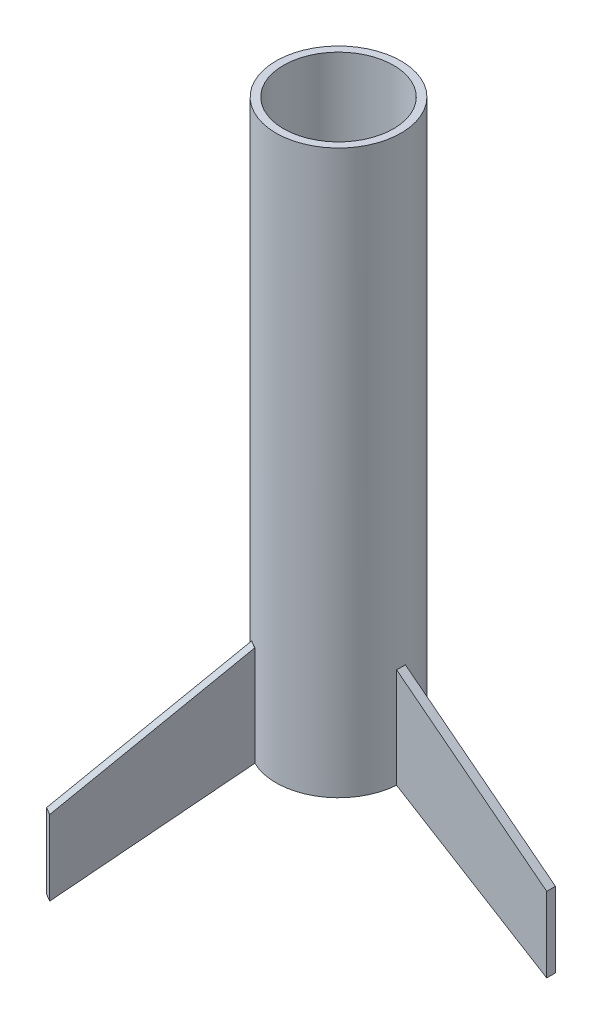
ISO-10303-21;
HEADER;
FILE_DESCRIPTION(('STEP AP214'),'2;1');
FILE_NAME('part.step','',(''),(''),'','','');
FILE_SCHEMA(('AUTOMOTIVE_DESIGN { 1 0 10303 214 1 1 1 1 }'));
ENDSEC;
DATA;
#1=APPLICATION_CONTEXT('core data for automotive mechanical design processes');
#2=APPLICATION_PROTOCOL_DEFINITION('international standard','automotive_design',2000,#1);
#3=PRODUCT_CONTEXT('',#1,'mechanical');
#4=PRODUCT('Part','Part','',(#3));
#5=PRODUCT_RELATED_PRODUCT_CATEGORY('part','',(#4));
#6=PRODUCT_DEFINITION_FORMATION('','',#4);
#7=PRODUCT_DEFINITION_CONTEXT('part definition',#1,'design');
#8=PRODUCT_DEFINITION('design','',#6,#7);
#9=PRODUCT_DEFINITION_SHAPE('','',#8);
#10=(LENGTH_UNIT() NAMED_UNIT(*) SI_UNIT(.MILLI.,.METRE.));
#11=(NAMED_UNIT(*) PLANE_ANGLE_UNIT() SI_UNIT($,.RADIAN.));
#12=(NAMED_UNIT(*) SI_UNIT($,.STERADIAN.) SOLID_ANGLE_UNIT());
#13=UNCERTAINTY_MEASURE_WITH_UNIT(LENGTH_MEASURE(1.E-05),#10,'distance_accuracy_value','');
#14=(GEOMETRIC_REPRESENTATION_CONTEXT(3) GLOBAL_UNCERTAINTY_ASSIGNED_CONTEXT((#13)) GLOBAL_UNIT_ASSIGNED_CONTEXT((#10,
#11,#12)) REPRESENTATION_CONTEXT('',''));
#15=CARTESIAN_POINT('',(0.,0.,0.));
#16=DIRECTION('',(0.,0.,1.));
#17=DIRECTION('',(1.,0.,0.));
#18=AXIS2_PLACEMENT_3D('',#15,#16,#17);
#19=CARTESIAN_POINT('',(0.,114.3,0.));
#20=DIRECTION('',(0.,-1.,0.));
#21=DIRECTION('',(0.,0.,-1.));
#22=AXIS2_PLACEMENT_3D('',#19,#20,#21);
#23=CYLINDRICAL_SURFACE('',#22,11.176);
#24=CARTESIAN_POINT('',(0.,0.,0.));
#25=DIRECTION('',(0.,1.,0.));
#26=DIRECTION('',(0.,0.,1.));
#27=AXIS2_PLACEMENT_3D('',#24,#25,#26);
#28=CIRCLE('',#27,11.176);
#29=CARTESIAN_POINT('',(0.,0.,11.176));
#30=VERTEX_POINT('',#29);
#31=EDGE_CURVE('E297',#30,#30,#28,.T.);
#32=ORIENTED_EDGE('',*,*,#31,.F.);
#33=EDGE_LOOP('',(#32));
#34=FACE_BOUND('',#33,.T.);
#35=CARTESIAN_POINT('',(0.,63.5,0.));
#36=DIRECTION('',(0.,1.,0.));
#37=DIRECTION('',(0.,0.,1.));
#38=AXIS2_PLACEMENT_3D('',#35,#36,#37);
#39=CIRCLE('',#38,11.176);
#40=CARTESIAN_POINT('',(0.,63.5,11.176));
#41=VERTEX_POINT('',#40);
#42=EDGE_CURVE('E597',#41,#41,#39,.T.);
#43=ORIENTED_EDGE('',*,*,#42,.T.);
#44=EDGE_LOOP('',(#43));
#45=FACE_BOUND('',#44,.T.);
#46=ADVANCED_FACE('F37',(#34,#45),#23,.F.);
#47=CARTESIAN_POINT('',(0.,114.3,0.));
#48=DIRECTION('',(0.,-1.,0.));
#49=DIRECTION('',(0.,0.,-1.));
#50=AXIS2_PLACEMENT_3D('',#47,#48,#49);
#51=CYLINDRICAL_SURFACE('',#50,12.7);
#52=CARTESIAN_POINT('',(0.,114.3,0.));
#53=DIRECTION('',(0.,1.,0.));
#54=DIRECTION('',(0.,0.,1.));
#55=AXIS2_PLACEMENT_3D('',#52,#53,#54);
#56=CIRCLE('',#55,12.7);
#57=CARTESIAN_POINT('',(0.,114.3,12.7));
#58=VERTEX_POINT('',#57);
#59=EDGE_CURVE('E300',#58,#58,#56,.T.);
#60=ORIENTED_EDGE('',*,*,#59,.F.);
#61=EDGE_LOOP('',(#60));
#62=FACE_BOUND('',#61,.T.);
#63=DIRECTION('',(0.,-1.,0.));
#64=VECTOR('',#63,1.);
#65=CARTESIAN_POINT('',(-5.56452681126259,114.3,-11.4160431571863));
#66=LINE('',#65,#64);
#67=CARTESIAN_POINT('',(-5.5645268112626,20.32,-11.4160431571863));
#68=VERTEX_POINT('',#67);
#69=CARTESIAN_POINT('',(-5.56452681126259,0.,-11.4160431571863));
#70=VERTEX_POINT('',#69);
#71=EDGE_CURVE('E206',#68,#70,#66,.T.);
#72=ORIENTED_EDGE('',*,*,#71,.F.);
#73=CARTESIAN_POINT('',(0.,20.32,0.));
#74=DIRECTION('',(0.,-1.,0.));
#75=DIRECTION('',(0.,0.,-1.));
#76=AXIS2_PLACEMENT_3D('',#73,#74,#75);
#77=CIRCLE('',#76,12.7);
#78=CARTESIAN_POINT('',(-6.3499999999999,20.32,-10.9985226280624));
#79=VERTEX_POINT('',#78);
#80=EDGE_CURVE('E196',#79,#68,#77,.T.);
#81=ORIENTED_EDGE('',*,*,#80,.F.);
#82=CARTESIAN_POINT('',(-7.10431997919133,20.32,-10.5270431571863));
#83=VERTEX_POINT('',#82);
#84=EDGE_CURVE('E198',#83,#79,#77,.T.);
#85=ORIENTED_EDGE('',*,*,#84,.F.);
#86=DIRECTION('',(0.,-1.,0.));
#87=VECTOR('',#86,1.);
#88=CARTESIAN_POINT('',(-7.10431997919133,114.3,-10.5270431571863));
#89=LINE('',#88,#87);
#90=CARTESIAN_POINT('',(-7.10431997919133,0.,-10.5270431571863));
#91=VERTEX_POINT('',#90);
#92=EDGE_CURVE('E204',#83,#91,#89,.T.);
#93=ORIENTED_EDGE('',*,*,#92,.T.);
#94=CARTESIAN_POINT('',(0.,0.,0.));
#95=DIRECTION('',(0.,1.,0.));
#96=DIRECTION('',(0.,0.,1.));
#97=AXIS2_PLACEMENT_3D('',#94,#95,#96);
#98=CIRCLE('',#97,12.7);
#99=CARTESIAN_POINT('',(-7.10431997919148,0.,10.5270431571862));
#100=VERTEX_POINT('',#99);
#101=EDGE_CURVE('E307',#91,#100,#98,.T.);
#102=ORIENTED_EDGE('',*,*,#101,.T.);
#103=DIRECTION('',(0.,-1.,0.));
#104=VECTOR('',#103,1.);
#105=CARTESIAN_POINT('',(-7.10431997919148,114.3,10.5270431571862));
#106=LINE('',#105,#104);
#107=CARTESIAN_POINT('',(-7.10431997919148,20.32,10.5270431571862));
#108=VERTEX_POINT('',#107);
#109=EDGE_CURVE('E249',#108,#100,#106,.T.);
#110=ORIENTED_EDGE('',*,*,#109,.F.);
#111=CARTESIAN_POINT('',(0.,20.32,0.));
#112=DIRECTION('',(0.,-1.,0.));
#113=DIRECTION('',(0.,0.,-1.));
#114=AXIS2_PLACEMENT_3D('',#111,#112,#113);
#115=CIRCLE('',#114,12.7);
#116=CARTESIAN_POINT('',(-6.35000000000005,20.32,10.9985226280623));
#117=VERTEX_POINT('',#116);
#118=EDGE_CURVE('E244',#117,#108,#115,.T.);
#119=ORIENTED_EDGE('',*,*,#118,.F.);
#120=CARTESIAN_POINT('',(-5.56452681126276,20.32,11.4160431571862));
#121=VERTEX_POINT('',#120);
#122=EDGE_CURVE('E246',#121,#117,#115,.T.);
#123=ORIENTED_EDGE('',*,*,#122,.F.);
#124=DIRECTION('',(0.,-1.,0.));
#125=VECTOR('',#124,1.);
#126=CARTESIAN_POINT('',(-5.56452681126276,114.3,11.4160431571862));
#127=LINE('',#126,#125);
#128=CARTESIAN_POINT('',(-5.56452681126275,0.,11.4160431571862));
#129=VERTEX_POINT('',#128);
#130=EDGE_CURVE('E247',#121,#129,#127,.T.);
#131=ORIENTED_EDGE('',*,*,#130,.T.);
#132=CARTESIAN_POINT('',(12.6688467904541,0.,0.889));
#133=VERTEX_POINT('',#132);
#134=EDGE_CURVE('E296',#129,#133,#98,.T.);
#135=ORIENTED_EDGE('',*,*,#134,.T.);
#136=DIRECTION('',(0.,-1.,0.));
#137=VECTOR('',#136,1.);
#138=CARTESIAN_POINT('',(12.6688467904541,114.3,0.889));
#139=LINE('',#138,#137);
#140=CARTESIAN_POINT('',(12.6688467904541,20.32,0.889));
#141=VERTEX_POINT('',#140);
#142=EDGE_CURVE('E45',#141,#133,#139,.T.);
#143=ORIENTED_EDGE('',*,*,#142,.F.);
#144=CARTESIAN_POINT('',(0.,20.32,0.));
#145=DIRECTION('',(0.,-1.,0.));
#146=DIRECTION('',(0.,0.,-1.));
#147=AXIS2_PLACEMENT_3D('',#144,#145,#146);
#148=CIRCLE('',#147,12.7);
#149=CARTESIAN_POINT('',(12.7,20.32,0.));
#150=VERTEX_POINT('',#149);
#151=EDGE_CURVE('E290',#150,#141,#148,.T.);
#152=ORIENTED_EDGE('',*,*,#151,.F.);
#153=CARTESIAN_POINT('',(12.6688467904541,20.32,-0.889));
#154=VERTEX_POINT('',#153);
#155=EDGE_CURVE('E292',#154,#150,#148,.T.);
#156=ORIENTED_EDGE('',*,*,#155,.F.);
#157=DIRECTION('',(0.,-1.,0.));
#158=VECTOR('',#157,1.);
#159=CARTESIAN_POINT('',(12.6688467904541,114.3,-0.889));
#160=LINE('',#159,#158);
#161=CARTESIAN_POINT('',(12.6688467904541,0.,-0.889));
#162=VERTEX_POINT('',#161);
#163=EDGE_CURVE('E303',#154,#162,#160,.T.);
#164=ORIENTED_EDGE('',*,*,#163,.T.);
#165=EDGE_CURVE('E304',#162,#70,#98,.T.);
#166=ORIENTED_EDGE('',*,*,#165,.T.);
#167=EDGE_LOOP('',(#72,#81,#85,#93,#102,#110,#119,#123,#131,#135,#143,#152,#156,#164,#166));
#168=FACE_BOUND('',#167,.T.);
#169=ADVANCED_FACE('F39',(#62,#168),#51,.T.);
#170=CARTESIAN_POINT('',(0.,114.3,0.));
#171=DIRECTION('',(0.,1.,0.));
#172=DIRECTION('',(0.,0.,1.));
#173=AXIS2_PLACEMENT_3D('',#170,#171,#172);
#174=PLANE('',#173);
#175=ORIENTED_EDGE('',*,*,#59,.T.);
#176=EDGE_LOOP('',(#175));
#177=FACE_BOUND('',#176,.T.);
#178=CARTESIAN_POINT('',(0.,114.3,0.));
#179=DIRECTION('',(0.,1.,0.));
#180=DIRECTION('',(0.,0.,1.));
#181=AXIS2_PLACEMENT_3D('',#178,#179,#180);
#182=CIRCLE('',#181,11.176);
#183=CARTESIAN_POINT('',(0.,114.3,11.176));
#184=VERTEX_POINT('',#183);
#185=EDGE_CURVE('E293',#184,#184,#182,.T.);
#186=ORIENTED_EDGE('',*,*,#185,.F.);
#187=EDGE_LOOP('',(#186));
#188=FACE_BOUND('',#187,.T.);
#189=ADVANCED_FACE('F360',(#177,#188),#174,.T.);
#190=CARTESIAN_POINT('',(0.,0.,0.));
#191=DIRECTION('',(0.,1.,0.));
#192=DIRECTION('',(0.,0.,1.));
#193=AXIS2_PLACEMENT_3D('',#190,#191,#192);
#194=PLANE('',#193);
#195=ORIENTED_EDGE('',*,*,#31,.T.);
#196=EDGE_LOOP('',(#195));
#197=FACE_BOUND('',#196,.T.);
#198=DIRECTION('',(-0.499999999999992,0.,-0.866025403784443));
#199=VECTOR('',#198,1.);
#200=CARTESIAN_POINT('',(-7.11989658396427,0.,-10.5540226280624));
#201=LINE('',#200,#199);
#202=CARTESIAN_POINT('',(-7.11989658396427,0.,-10.5540226280624));
#203=VERTEX_POINT('',#202);
#204=EDGE_CURVE('E52',#91,#203,#201,.T.);
#205=ORIENTED_EDGE('',*,*,#204,.T.);
#206=DIRECTION('',(-0.866025403784443,0.,0.499999999999992));
#207=VECTOR('',#206,1.);
#208=CARTESIAN_POINT('',(-5.58010341603553,0.,-11.4430226280624));
#209=LINE('',#208,#207);
#210=CARTESIAN_POINT('',(-5.58010341603553,0.,-11.4430226280624));
#211=VERTEX_POINT('',#210);
#212=EDGE_CURVE('E606',#211,#203,#209,.T.);
#213=ORIENTED_EDGE('',*,*,#212,.F.);
#214=DIRECTION('',(-0.499999999999992,0.,-0.866025403784443));
#215=VECTOR('',#214,1.);
#216=CARTESIAN_POINT('',(-5.58010341603553,0.,-11.4430226280624));
#217=LINE('',#216,#215);
#218=EDGE_CURVE('E190',#70,#211,#217,.T.);
#219=ORIENTED_EDGE('',*,*,#218,.F.);
#220=ORIENTED_EDGE('',*,*,#165,.F.);
#221=DIRECTION('',(1.,0.,0.));
#222=VECTOR('',#221,1.);
#223=CARTESIAN_POINT('',(12.7,0.,-0.889));
#224=LINE('',#223,#222);
#225=CARTESIAN_POINT('',(12.7,0.,-0.889));
#226=VERTEX_POINT('',#225);
#227=EDGE_CURVE('E257',#162,#226,#224,.T.);
#228=ORIENTED_EDGE('',*,*,#227,.T.);
#229=DIRECTION('',(0.,0.,-1.));
#230=VECTOR('',#229,1.);
#231=CARTESIAN_POINT('',(12.7,0.,0.889));
#232=LINE('',#231,#230);
#233=CARTESIAN_POINT('',(12.7,0.,0.889));
#234=VERTEX_POINT('',#233);
#235=EDGE_CURVE('E266',#234,#226,#232,.T.);
#236=ORIENTED_EDGE('',*,*,#235,.F.);
#237=DIRECTION('',(1.,0.,0.));
#238=VECTOR('',#237,1.);
#239=CARTESIAN_POINT('',(12.7,0.,0.889));
#240=LINE('',#239,#238);
#241=EDGE_CURVE('E264',#133,#234,#240,.T.);
#242=ORIENTED_EDGE('',*,*,#241,.F.);
#243=ORIENTED_EDGE('',*,*,#134,.F.);
#244=DIRECTION('',(-0.500000000000004,0.,0.866025403784436));
#245=VECTOR('',#244,1.);
#246=CARTESIAN_POINT('',(-5.58010341603569,0.,11.4430226280623));
#247=LINE('',#246,#245);
#248=CARTESIAN_POINT('',(-5.58010341603569,0.,11.4430226280623));
#249=VERTEX_POINT('',#248);
#250=EDGE_CURVE('E60',#129,#249,#247,.T.);
#251=ORIENTED_EDGE('',*,*,#250,.T.);
#252=DIRECTION('',(0.866025403784436,0.,0.500000000000004));
#253=VECTOR('',#252,1.);
#254=CARTESIAN_POINT('',(-7.11989658396442,0.,10.5540226280623));
#255=LINE('',#254,#253);
#256=CARTESIAN_POINT('',(-7.11989658396442,0.,10.5540226280623));
#257=VERTEX_POINT('',#256);
#258=EDGE_CURVE('E221',#257,#249,#255,.T.);
#259=ORIENTED_EDGE('',*,*,#258,.F.);
#260=DIRECTION('',(-0.500000000000004,0.,0.866025403784436));
#261=VECTOR('',#260,1.);
#262=CARTESIAN_POINT('',(-7.11989658396442,0.,10.5540226280623));
#263=LINE('',#262,#261);
#264=EDGE_CURVE('E219',#100,#257,#263,.T.);
#265=ORIENTED_EDGE('',*,*,#264,.F.);
#266=ORIENTED_EDGE('',*,*,#101,.F.);
#267=EDGE_LOOP('',(#205,#213,#219,#220,#228,#236,#242,#243,#251,#259,#265,#266));
#268=FACE_BOUND('',#267,.T.);
#269=ADVANCED_FACE('F320',(#197,#268),#194,.F.);
#270=CARTESIAN_POINT('',(0.,66.675,0.));
#271=DIRECTION('',(0.,1.,0.));
#272=DIRECTION('',(0.,0.,1.));
#273=AXIS2_PLACEMENT_3D('',#270,#271,#272);
#274=CIRCLE('',#273,11.176);
#275=CARTESIAN_POINT('',(0.,66.675,11.176));
#276=VERTEX_POINT('',#275);
#277=EDGE_CURVE('E11',#276,#276,#274,.T.);
#278=ORIENTED_EDGE('',*,*,#277,.F.);
#279=EDGE_LOOP('',(#278));
#280=FACE_BOUND('',#279,.T.);
#281=ORIENTED_EDGE('',*,*,#185,.T.);
#282=EDGE_LOOP('',(#281));
#283=FACE_BOUND('',#282,.T.);
#284=ADVANCED_FACE('F352',(#280,#283),#23,.F.);
#285=CARTESIAN_POINT('',(0.,0.,0.889));
#286=DIRECTION('',(0.,0.,-1.));
#287=DIRECTION('',(-1.,0.,0.));
#288=AXIS2_PLACEMENT_3D('',#285,#286,#287);
#289=PLANE('',#288);
#290=DIRECTION('',(-1.,0.,0.));
#291=VECTOR('',#290,1.);
#292=CARTESIAN_POINT('',(11.176,20.32,0.889));
#293=LINE('',#292,#291);
#294=CARTESIAN_POINT('',(12.7,20.32,0.889));
#295=VERTEX_POINT('',#294);
#296=EDGE_CURVE('E261',#295,#141,#293,.T.);
#297=ORIENTED_EDGE('',*,*,#296,.T.);
#298=ORIENTED_EDGE('',*,*,#142,.T.);
#299=ORIENTED_EDGE('',*,*,#241,.T.);
#300=DIRECTION('',(0.853015668858684,-0.521885302227963,0.));
#301=VECTOR('',#300,1.);
#302=CARTESIAN_POINT('',(43.18,-18.6480326125681,0.889));
#303=LINE('',#302,#301);
#304=CARTESIAN_POINT('',(43.18,-18.6480326125681,0.889));
#305=VERTEX_POINT('',#304);
#306=EDGE_CURVE('E253',#234,#305,#303,.T.);
#307=ORIENTED_EDGE('',*,*,#306,.T.);
#308=DIRECTION('',(0.,1.,0.));
#309=VECTOR('',#308,1.);
#310=CARTESIAN_POINT('',(43.18,-3.40803261256808,0.889));
#311=LINE('',#310,#309);
#312=CARTESIAN_POINT('',(43.18,-3.40803261256808,0.889));
#313=VERTEX_POINT('',#312);
#314=EDGE_CURVE('E256',#305,#313,#311,.T.);
#315=ORIENTED_EDGE('',*,*,#314,.T.);
#316=DIRECTION('',(-0.789084084834688,0.614285200098947,0.));
#317=VECTOR('',#316,1.);
#318=CARTESIAN_POINT('',(12.7,20.32,0.889));
#319=LINE('',#318,#317);
#320=EDGE_CURVE('E259',#313,#295,#319,.T.);
#321=ORIENTED_EDGE('',*,*,#320,.T.);
#322=EDGE_LOOP('',(#297,#298,#299,#307,#315,#321));
#323=FACE_BOUND('',#322,.T.);
#324=ADVANCED_FACE('F313',(#323),#289,.F.);
#325=CARTESIAN_POINT('',(0.,0.,-0.889));
#326=DIRECTION('',(0.,0.,-1.));
#327=DIRECTION('',(-1.,0.,0.));
#328=AXIS2_PLACEMENT_3D('',#325,#326,#327);
#329=PLANE('',#328);
#330=ORIENTED_EDGE('',*,*,#163,.F.);
#331=DIRECTION('',(-1.,0.,0.));
#332=VECTOR('',#331,1.);
#333=CARTESIAN_POINT('',(11.176,20.32,-0.889));
#334=LINE('',#333,#332);
#335=CARTESIAN_POINT('',(12.7,20.32,-0.889));
#336=VERTEX_POINT('',#335);
#337=EDGE_CURVE('E274',#336,#154,#334,.T.);
#338=ORIENTED_EDGE('',*,*,#337,.F.);
#339=DIRECTION('',(-0.789084084834688,0.614285200098947,0.));
#340=VECTOR('',#339,1.);
#341=CARTESIAN_POINT('',(12.7,20.32,-0.889));
#342=LINE('',#341,#340);
#343=CARTESIAN_POINT('',(43.18,-3.40803261256808,-0.889));
#344=VERTEX_POINT('',#343);
#345=EDGE_CURVE('E271',#344,#336,#342,.T.);
#346=ORIENTED_EDGE('',*,*,#345,.F.);
#347=DIRECTION('',(0.,1.,0.));
#348=VECTOR('',#347,1.);
#349=CARTESIAN_POINT('',(43.18,-3.40803261256808,-0.889));
#350=LINE('',#349,#348);
#351=CARTESIAN_POINT('',(43.18,-18.6480326125681,-0.889));
#352=VERTEX_POINT('',#351);
#353=EDGE_CURVE('E269',#352,#344,#350,.T.);
#354=ORIENTED_EDGE('',*,*,#353,.F.);
#355=DIRECTION('',(0.853015668858684,-0.521885302227963,0.));
#356=VECTOR('',#355,1.);
#357=CARTESIAN_POINT('',(43.18,-18.6480326125681,-0.889));
#358=LINE('',#357,#356);
#359=EDGE_CURVE('E252',#226,#352,#358,.T.);
#360=ORIENTED_EDGE('',*,*,#359,.F.);
#361=ORIENTED_EDGE('',*,*,#227,.F.);
#362=EDGE_LOOP('',(#330,#338,#346,#354,#360,#361));
#363=FACE_BOUND('',#362,.T.);
#364=ADVANCED_FACE('F344',(#363),#329,.T.);
#365=CARTESIAN_POINT('',(11.176,20.32,0.889));
#366=DIRECTION('',(0.,-1.,0.));
#367=DIRECTION('',(0.,0.,-1.));
#368=AXIS2_PLACEMENT_3D('',#365,#366,#367);
#369=PLANE('',#368);
#370=ORIENTED_EDGE('',*,*,#337,.T.);
#371=ORIENTED_EDGE('',*,*,#155,.T.);
#372=DIRECTION('',(0.,0.,-1.));
#373=VECTOR('',#372,1.);
#374=CARTESIAN_POINT('',(12.7,20.32,0.889));
#375=LINE('',#374,#373);
#376=EDGE_CURVE('E280',#150,#336,#375,.T.);
#377=ORIENTED_EDGE('',*,*,#376,.T.);
#378=EDGE_LOOP('',(#370,#371,#377));
#379=FACE_BOUND('',#378,.T.);
#380=ADVANCED_FACE('F341',(#379),#369,.F.);
#381=CARTESIAN_POINT('',(43.18,-18.6480326125681,0.889));
#382=DIRECTION('',(0.521885302227963,0.853015668858684,0.));
#383=DIRECTION('',(-0.853015668858684,0.521885302227963,0.));
#384=AXIS2_PLACEMENT_3D('',#381,#382,#383);
#385=PLANE('',#384);
#386=ORIENTED_EDGE('',*,*,#359,.T.);
#387=DIRECTION('',(0.,0.,-1.));
#388=VECTOR('',#387,1.);
#389=CARTESIAN_POINT('',(43.18,-18.6480326125681,0.889));
#390=LINE('',#389,#388);
#391=EDGE_CURVE('E287',#305,#352,#390,.T.);
#392=ORIENTED_EDGE('',*,*,#391,.F.);
#393=ORIENTED_EDGE('',*,*,#306,.F.);
#394=ORIENTED_EDGE('',*,*,#235,.T.);
#395=EDGE_LOOP('',(#386,#392,#393,#394));
#396=FACE_BOUND('',#395,.T.);
#397=ADVANCED_FACE('F326',(#396),#385,.F.);
#398=CARTESIAN_POINT('',(43.18,-3.40803261256808,0.889));
#399=DIRECTION('',(-1.,0.,0.));
#400=DIRECTION('',(0.,-1.,0.));
#401=AXIS2_PLACEMENT_3D('',#398,#399,#400);
#402=PLANE('',#401);
#403=ORIENTED_EDGE('',*,*,#353,.T.);
#404=DIRECTION('',(0.,0.,-1.));
#405=VECTOR('',#404,1.);
#406=CARTESIAN_POINT('',(43.18,-3.40803261256808,0.889));
#407=LINE('',#406,#405);
#408=EDGE_CURVE('E284',#313,#344,#407,.T.);
#409=ORIENTED_EDGE('',*,*,#408,.F.);
#410=ORIENTED_EDGE('',*,*,#314,.F.);
#411=ORIENTED_EDGE('',*,*,#391,.T.);
#412=EDGE_LOOP('',(#403,#409,#410,#411));
#413=FACE_BOUND('',#412,.T.);
#414=ADVANCED_FACE('F331',(#413),#402,.F.);
#415=CARTESIAN_POINT('',(12.7,20.32,0.889));
#416=DIRECTION('',(-0.614285200098947,-0.789084084834688,0.));
#417=DIRECTION('',(0.789084084834688,-0.614285200098947,0.));
#418=AXIS2_PLACEMENT_3D('',#415,#416,#417);
#419=PLANE('',#418);
#420=ORIENTED_EDGE('',*,*,#345,.T.);
#421=ORIENTED_EDGE('',*,*,#376,.F.);
#422=EDGE_CURVE('E281',#295,#150,#375,.T.);
#423=ORIENTED_EDGE('',*,*,#422,.F.);
#424=ORIENTED_EDGE('',*,*,#320,.F.);
#425=ORIENTED_EDGE('',*,*,#408,.T.);
#426=EDGE_LOOP('',(#420,#421,#423,#424,#425));
#427=FACE_BOUND('',#426,.T.);
#428=ADVANCED_FACE('F334',(#427),#419,.F.);
#429=ORIENTED_EDGE('',*,*,#422,.T.);
#430=ORIENTED_EDGE('',*,*,#151,.T.);
#431=ORIENTED_EDGE('',*,*,#296,.F.);
#432=EDGE_LOOP('',(#429,#430,#431));
#433=FACE_BOUND('',#432,.T.);
#434=ADVANCED_FACE('F337',(#433),#369,.F.);
#435=CARTESIAN_POINT('',(-0.769896583964364,0.,-0.444500000000004));
#436=DIRECTION('',(0.866025403784436,0.,0.500000000000004));
#437=DIRECTION('',(0.500000000000004,0.,-0.866025403784436));
#438=AXIS2_PLACEMENT_3D('',#435,#436,#437);
#439=PLANE('',#438);
#440=DIRECTION('',(0.500000000000004,0.,-0.866025403784436));
#441=VECTOR('',#440,1.);
#442=CARTESIAN_POINT('',(-6.35789658396441,20.32,9.23419991269486));
#443=LINE('',#442,#441);
#444=CARTESIAN_POINT('',(-7.11989658396442,20.32,10.5540226280623));
#445=VERTEX_POINT('',#444);
#446=EDGE_CURVE('E216',#445,#108,#443,.T.);
#447=ORIENTED_EDGE('',*,*,#446,.T.);
#448=ORIENTED_EDGE('',*,*,#109,.T.);
#449=ORIENTED_EDGE('',*,*,#264,.T.);
#450=DIRECTION('',(-0.426507834429345,-0.521885302227963,0.738733239057793));
#451=VECTOR('',#450,1.);
#452=CARTESIAN_POINT('',(-22.3598965839645,-18.6480326125681,36.9504769354119));
#453=LINE('',#452,#451);
#454=CARTESIAN_POINT('',(-22.3598965839645,-18.6480326125681,36.9504769354119));
#455=VERTEX_POINT('',#454);
#456=EDGE_CURVE('E209',#257,#455,#453,.T.);
#457=ORIENTED_EDGE('',*,*,#456,.T.);
#458=DIRECTION('',(0.,1.,0.));
#459=VECTOR('',#458,1.);
#460=CARTESIAN_POINT('',(-22.3598965839645,-3.40803261256808,36.950476935412));
#461=LINE('',#460,#459);
#462=CARTESIAN_POINT('',(-22.3598965839645,-3.40803261256808,36.950476935412));
#463=VERTEX_POINT('',#462);
#464=EDGE_CURVE('E212',#455,#463,#461,.T.);
#465=ORIENTED_EDGE('',*,*,#464,.T.);
#466=DIRECTION('',(0.394542042417347,0.614285200098947,-0.683366863188833));
#467=VECTOR('',#466,1.);
#468=CARTESIAN_POINT('',(-7.11989658396442,20.32,10.5540226280623));
#469=LINE('',#468,#467);
#470=EDGE_CURVE('E214',#463,#445,#469,.T.);
#471=ORIENTED_EDGE('',*,*,#470,.T.);
#472=EDGE_LOOP('',(#447,#448,#449,#457,#465,#471));
#473=FACE_BOUND('',#472,.T.);
#474=ADVANCED_FACE('F398',(#473),#439,.F.);
#475=CARTESIAN_POINT('',(0.769896583964364,0.,0.444500000000004));
#476=DIRECTION('',(0.866025403784436,0.,0.500000000000004));
#477=DIRECTION('',(0.500000000000004,0.,-0.866025403784436));
#478=AXIS2_PLACEMENT_3D('',#475,#476,#477);
#479=PLANE('',#478);
#480=ORIENTED_EDGE('',*,*,#130,.F.);
#481=DIRECTION('',(0.500000000000004,0.,-0.866025403784436));
#482=VECTOR('',#481,1.);
#483=CARTESIAN_POINT('',(-4.81810341603568,20.32,10.1231999126949));
#484=LINE('',#483,#482);
#485=CARTESIAN_POINT('',(-5.58010341603569,20.32,11.4430226280623));
#486=VERTEX_POINT('',#485);
#487=EDGE_CURVE('E229',#486,#121,#484,.T.);
#488=ORIENTED_EDGE('',*,*,#487,.F.);
#489=DIRECTION('',(0.394542042417347,0.614285200098947,-0.683366863188833));
#490=VECTOR('',#489,1.);
#491=CARTESIAN_POINT('',(-5.58010341603569,20.32,11.4430226280623));
#492=LINE('',#491,#490);
#493=CARTESIAN_POINT('',(-20.8201034160358,-3.40803261256808,37.839476935412));
#494=VERTEX_POINT('',#493);
#495=EDGE_CURVE('E226',#494,#486,#492,.T.);
#496=ORIENTED_EDGE('',*,*,#495,.F.);
#497=DIRECTION('',(0.,1.,0.));
#498=VECTOR('',#497,1.);
#499=CARTESIAN_POINT('',(-20.8201034160358,-3.40803261256808,37.839476935412));
#500=LINE('',#499,#498);
#501=CARTESIAN_POINT('',(-20.8201034160358,-18.6480326125681,37.839476935412));
#502=VERTEX_POINT('',#501);
#503=EDGE_CURVE('E224',#502,#494,#500,.T.);
#504=ORIENTED_EDGE('',*,*,#503,.F.);
#505=DIRECTION('',(-0.426507834429345,-0.521885302227963,0.738733239057793));
#506=VECTOR('',#505,1.);
#507=CARTESIAN_POINT('',(-20.8201034160358,-18.6480326125681,37.839476935412));
#508=LINE('',#507,#506);
#509=EDGE_CURVE('E208',#249,#502,#508,.T.);
#510=ORIENTED_EDGE('',*,*,#509,.F.);
#511=ORIENTED_EDGE('',*,*,#250,.F.);
#512=EDGE_LOOP('',(#480,#488,#496,#504,#510,#511));
#513=FACE_BOUND('',#512,.T.);
#514=ADVANCED_FACE('F402',(#513),#479,.T.);
#515=CARTESIAN_POINT('',(-6.35789658396441,20.32,9.23419991269486));
#516=DIRECTION('',(0.,-1.,0.));
#517=DIRECTION('',(0.,0.,-1.));
#518=AXIS2_PLACEMENT_3D('',#515,#516,#517);
#519=PLANE('',#518);
#520=ORIENTED_EDGE('',*,*,#487,.T.);
#521=ORIENTED_EDGE('',*,*,#122,.T.);
#522=DIRECTION('',(0.866025403784436,0.,0.500000000000004));
#523=VECTOR('',#522,1.);
#524=CARTESIAN_POINT('',(-7.11989658396442,20.32,10.5540226280623));
#525=LINE('',#524,#523);
#526=EDGE_CURVE('E234',#117,#486,#525,.T.);
#527=ORIENTED_EDGE('',*,*,#526,.T.);
#528=EDGE_LOOP('',(#520,#521,#527));
#529=FACE_BOUND('',#528,.T.);
#530=ADVANCED_FACE('F414',(#529),#519,.F.);
#531=CARTESIAN_POINT('',(-22.3598965839645,-18.6480326125681,36.9504769354119));
#532=DIRECTION('',(-0.260942651113984,0.853015668858684,0.451965929591134));
#533=DIRECTION('',(0.,-0.468186579350356,0.883629632208095));
#534=AXIS2_PLACEMENT_3D('',#531,#532,#533);
#535=PLANE('',#534);
#536=ORIENTED_EDGE('',*,*,#509,.T.);
#537=DIRECTION('',(0.866025403784436,0.,0.500000000000004));
#538=VECTOR('',#537,1.);
#539=CARTESIAN_POINT('',(-22.3598965839645,-18.6480326125681,36.9504769354119));
#540=LINE('',#539,#538);
#541=EDGE_CURVE('E241',#455,#502,#540,.T.);
#542=ORIENTED_EDGE('',*,*,#541,.F.);
#543=ORIENTED_EDGE('',*,*,#456,.F.);
#544=ORIENTED_EDGE('',*,*,#258,.T.);
#545=EDGE_LOOP('',(#536,#542,#543,#544));
#546=FACE_BOUND('',#545,.T.);
#547=ADVANCED_FACE('F424',(#546),#535,.F.);
#548=CARTESIAN_POINT('',(-22.3598965839645,-3.40803261256808,36.950476935412));
#549=DIRECTION('',(0.500000000000004,0.,-0.866025403784436));
#550=DIRECTION('',(-0.866025403784436,0.,-0.500000000000004));
#551=AXIS2_PLACEMENT_3D('',#548,#549,#550);
#552=PLANE('',#551);
#553=ORIENTED_EDGE('',*,*,#503,.T.);
#554=DIRECTION('',(0.866025403784436,0.,0.500000000000004));
#555=VECTOR('',#554,1.);
#556=CARTESIAN_POINT('',(-22.3598965839645,-3.40803261256808,36.950476935412));
#557=LINE('',#556,#555);
#558=EDGE_CURVE('E238',#463,#494,#557,.T.);
#559=ORIENTED_EDGE('',*,*,#558,.F.);
#560=ORIENTED_EDGE('',*,*,#464,.F.);
#561=ORIENTED_EDGE('',*,*,#541,.T.);
#562=EDGE_LOOP('',(#553,#559,#560,#561));
#563=FACE_BOUND('',#562,.T.);
#564=ADVANCED_FACE('F436',(#563),#552,.F.);
#565=CARTESIAN_POINT('',(-7.11989658396442,20.32,10.5540226280623));
#566=DIRECTION('',(0.307142600049476,-0.789084084834688,-0.531986588454494));
#567=DIRECTION('',(0.,0.55900702999698,-0.829162915484017));
#568=AXIS2_PLACEMENT_3D('',#565,#566,#567);
#569=PLANE('',#568);
#570=ORIENTED_EDGE('',*,*,#495,.T.);
#571=ORIENTED_EDGE('',*,*,#526,.F.);
#572=EDGE_CURVE('E235',#445,#117,#525,.T.);
#573=ORIENTED_EDGE('',*,*,#572,.F.);
#574=ORIENTED_EDGE('',*,*,#470,.F.);
#575=ORIENTED_EDGE('',*,*,#558,.T.);
#576=EDGE_LOOP('',(#570,#571,#573,#574,#575));
#577=FACE_BOUND('',#576,.T.);
#578=ADVANCED_FACE('F447',(#577),#569,.F.);
#579=ORIENTED_EDGE('',*,*,#572,.T.);
#580=ORIENTED_EDGE('',*,*,#118,.T.);
#581=ORIENTED_EDGE('',*,*,#446,.F.);
#582=EDGE_LOOP('',(#579,#580,#581));
#583=FACE_BOUND('',#582,.T.);
#584=ADVANCED_FACE('F427',(#583),#519,.F.);
#585=CARTESIAN_POINT('',(0.76989658396437,0.,-0.444499999999993));
#586=DIRECTION('',(-0.866025403784443,0.,0.499999999999992));
#587=DIRECTION('',(0.499999999999992,0.,0.866025403784443));
#588=AXIS2_PLACEMENT_3D('',#585,#586,#587);
#589=PLANE('',#588);
#590=DIRECTION('',(0.499999999999992,0.,0.866025403784443));
#591=VECTOR('',#590,1.);
#592=CARTESIAN_POINT('',(-4.81810341603554,20.32,-10.1231999126949));
#593=LINE('',#592,#591);
#594=CARTESIAN_POINT('',(-5.58010341603553,20.32,-11.4430226280624));
#595=VERTEX_POINT('',#594);
#596=EDGE_CURVE('E603',#595,#68,#593,.T.);
#597=ORIENTED_EDGE('',*,*,#596,.T.);
#598=ORIENTED_EDGE('',*,*,#71,.T.);
#599=ORIENTED_EDGE('',*,*,#218,.T.);
#600=DIRECTION('',(-0.426507834429335,-0.521885302227963,-0.738733239057799));
#601=VECTOR('',#600,1.);
#602=CARTESIAN_POINT('',(-20.8201034160353,-18.6480326125681,-37.8394769354122));
#603=LINE('',#602,#601);
#604=CARTESIAN_POINT('',(-20.8201034160353,-18.6480326125681,-37.8394769354122));
#605=VERTEX_POINT('',#604);
#606=EDGE_CURVE('E184',#211,#605,#603,.T.);
#607=ORIENTED_EDGE('',*,*,#606,.T.);
#608=DIRECTION('',(0.,1.,0.));
#609=VECTOR('',#608,1.);
#610=CARTESIAN_POINT('',(-20.8201034160353,-3.40803261256808,-37.8394769354123));
#611=LINE('',#610,#609);
#612=CARTESIAN_POINT('',(-20.8201034160353,-3.40803261256808,-37.8394769354123));
#613=VERTEX_POINT('',#612);
#614=EDGE_CURVE('E173',#605,#613,#611,.T.);
#615=ORIENTED_EDGE('',*,*,#614,.T.);
#616=DIRECTION('',(0.394542042417337,0.614285200098947,0.683366863188838));
#617=VECTOR('',#616,1.);
#618=CARTESIAN_POINT('',(-5.58010341603553,20.32,-11.4430226280624));
#619=LINE('',#618,#617);
#620=EDGE_CURVE('E183',#613,#595,#619,.T.);
#621=ORIENTED_EDGE('',*,*,#620,.T.);
#622=EDGE_LOOP('',(#597,#598,#599,#607,#615,#621));
#623=FACE_BOUND('',#622,.T.);
#624=ADVANCED_FACE('F188',(#623),#589,.F.);
#625=CARTESIAN_POINT('',(-0.76989658396437,0.,0.444499999999993));
#626=DIRECTION('',(-0.866025403784443,0.,0.499999999999992));
#627=DIRECTION('',(0.499999999999992,0.,0.866025403784443));
#628=AXIS2_PLACEMENT_3D('',#625,#626,#627);
#629=PLANE('',#628);
#630=ORIENTED_EDGE('',*,*,#92,.F.);
#631=DIRECTION('',(0.499999999999992,0.,0.866025403784443));
#632=VECTOR('',#631,1.);
#633=CARTESIAN_POINT('',(-6.35789658396428,20.32,-9.23419991269494));
#634=LINE('',#633,#632);
#635=CARTESIAN_POINT('',(-7.11989658396427,20.32,-10.5540226280624));
#636=VERTEX_POINT('',#635);
#637=EDGE_CURVE('E613',#636,#83,#634,.T.);
#638=ORIENTED_EDGE('',*,*,#637,.F.);
#639=DIRECTION('',(0.394542042417337,0.614285200098947,0.683366863188838));
#640=VECTOR('',#639,1.);
#641=CARTESIAN_POINT('',(-7.11989658396427,20.32,-10.5540226280624));
#642=LINE('',#641,#640);
#643=CARTESIAN_POINT('',(-22.359896583964,-3.40803261256808,-36.9504769354123));
#644=VERTEX_POINT('',#643);
#645=EDGE_CURVE('E610',#644,#636,#642,.T.);
#646=ORIENTED_EDGE('',*,*,#645,.F.);
#647=DIRECTION('',(0.,1.,0.));
#648=VECTOR('',#647,1.);
#649=CARTESIAN_POINT('',(-22.359896583964,-3.40803261256808,-36.9504769354123));
#650=LINE('',#649,#648);
#651=CARTESIAN_POINT('',(-22.359896583964,-18.6480326125681,-36.9504769354123));
#652=VERTEX_POINT('',#651);
#653=EDGE_CURVE('E608',#652,#644,#650,.T.);
#654=ORIENTED_EDGE('',*,*,#653,.F.);
#655=DIRECTION('',(-0.426507834429335,-0.521885302227963,-0.738733239057799));
#656=VECTOR('',#655,1.);
#657=CARTESIAN_POINT('',(-22.359896583964,-18.6480326125681,-36.9504769354123));
#658=LINE('',#657,#656);
#659=EDGE_CURVE('E195',#203,#652,#658,.T.);
#660=ORIENTED_EDGE('',*,*,#659,.F.);
#661=ORIENTED_EDGE('',*,*,#204,.F.);
#662=EDGE_LOOP('',(#630,#638,#646,#654,#660,#661));
#663=FACE_BOUND('',#662,.T.);
#664=ADVANCED_FACE('F477',(#663),#629,.T.);
#665=CARTESIAN_POINT('',(-4.81810341603554,20.32,-10.1231999126949));
#666=DIRECTION('',(0.,-1.,0.));
#667=DIRECTION('',(0.,0.,-1.));
#668=AXIS2_PLACEMENT_3D('',#665,#666,#667);
#669=PLANE('',#668);
#670=ORIENTED_EDGE('',*,*,#637,.T.);
#671=ORIENTED_EDGE('',*,*,#84,.T.);
#672=DIRECTION('',(-0.866025403784443,0.,0.499999999999992));
#673=VECTOR('',#672,1.);
#674=CARTESIAN_POINT('',(-5.58010341603553,20.32,-11.4430226280624));
#675=LINE('',#674,#673);
#676=EDGE_CURVE('E617',#79,#636,#675,.T.);
#677=ORIENTED_EDGE('',*,*,#676,.T.);
#678=EDGE_LOOP('',(#670,#671,#677));
#679=FACE_BOUND('',#678,.T.);
#680=ADVANCED_FACE('F487',(#679),#669,.F.);
#681=CARTESIAN_POINT('',(-20.8201034160353,-18.6480326125681,-37.8394769354122));
#682=DIRECTION('',(-0.260942651113977,0.853015668858684,-0.451965929591138));
#683=DIRECTION('',(0.,0.468186579350359,0.883629632208093));
#684=AXIS2_PLACEMENT_3D('',#681,#682,#683);
#685=PLANE('',#684);
#686=ORIENTED_EDGE('',*,*,#659,.T.);
#687=DIRECTION('',(-0.866025403784443,0.,0.499999999999992));
#688=VECTOR('',#687,1.);
#689=CARTESIAN_POINT('',(-20.8201034160353,-18.6480326125681,-37.8394769354122));
#690=LINE('',#689,#688);
#691=EDGE_CURVE('E177',#605,#652,#690,.T.);
#692=ORIENTED_EDGE('',*,*,#691,.F.);
#693=ORIENTED_EDGE('',*,*,#606,.F.);
#694=ORIENTED_EDGE('',*,*,#212,.T.);
#695=EDGE_LOOP('',(#686,#692,#693,#694));
#696=FACE_BOUND('',#695,.T.);
#697=ADVANCED_FACE('F194',(#696),#685,.F.);
#698=CARTESIAN_POINT('',(-20.8201034160353,-3.40803261256808,-37.8394769354123));
#699=DIRECTION('',(0.499999999999992,0.,0.866025403784443));
#700=DIRECTION('',(0.866025403784443,0.,-0.499999999999992));
#701=AXIS2_PLACEMENT_3D('',#698,#699,#700);
#702=PLANE('',#701);
#703=ORIENTED_EDGE('',*,*,#653,.T.);
#704=DIRECTION('',(-0.866025403784443,0.,0.499999999999992));
#705=VECTOR('',#704,1.);
#706=CARTESIAN_POINT('',(-20.8201034160353,-3.40803261256808,-37.8394769354123));
#707=LINE('',#706,#705);
#708=EDGE_CURVE('E180',#613,#644,#707,.T.);
#709=ORIENTED_EDGE('',*,*,#708,.F.);
#710=ORIENTED_EDGE('',*,*,#614,.F.);
#711=ORIENTED_EDGE('',*,*,#691,.T.);
#712=EDGE_LOOP('',(#703,#709,#710,#711));
#713=FACE_BOUND('',#712,.T.);
#714=ADVANCED_FACE('F175',(#713),#702,.F.);
#715=CARTESIAN_POINT('',(-5.58010341603553,20.32,-11.4430226280624));
#716=DIRECTION('',(0.307142600049469,-0.789084084834688,0.531986588454498));
#717=DIRECTION('',(0.,-0.559007029996984,-0.829162915484015));
#718=AXIS2_PLACEMENT_3D('',#715,#716,#717);
#719=PLANE('',#718);
#720=ORIENTED_EDGE('',*,*,#645,.T.);
#721=ORIENTED_EDGE('',*,*,#676,.F.);
#722=EDGE_CURVE('E200',#595,#79,#675,.T.);
#723=ORIENTED_EDGE('',*,*,#722,.F.);
#724=ORIENTED_EDGE('',*,*,#620,.F.);
#725=ORIENTED_EDGE('',*,*,#708,.T.);
#726=EDGE_LOOP('',(#720,#721,#723,#724,#725));
#727=FACE_BOUND('',#726,.T.);
#728=ADVANCED_FACE('F517',(#727),#719,.F.);
#729=ORIENTED_EDGE('',*,*,#722,.T.);
#730=ORIENTED_EDGE('',*,*,#80,.T.);
#731=ORIENTED_EDGE('',*,*,#596,.F.);
#732=EDGE_LOOP('',(#729,#730,#731));
#733=FACE_BOUND('',#732,.T.);
#734=ADVANCED_FACE('F499',(#733),#669,.F.);
#735=CARTESIAN_POINT('',(0.,66.675,0.));
#736=DIRECTION('',(0.,1.,0.));
#737=DIRECTION('',(0.,0.,1.));
#738=AXIS2_PLACEMENT_3D('',#735,#736,#737);
#739=PLANE('',#738);
#740=ORIENTED_EDGE('',*,*,#277,.T.);
#741=EDGE_LOOP('',(#740));
#742=FACE_BOUND('',#741,.T.);
#743=CARTESIAN_POINT('',(0.,66.675,0.));
#744=DIRECTION('',(0.,1.,0.));
#745=DIRECTION('',(0.,0.,1.));
#746=AXIS2_PLACEMENT_3D('',#743,#744,#745);
#747=CIRCLE('',#746,6.35);
#748=CARTESIAN_POINT('',(0.,66.675,6.35));
#749=VERTEX_POINT('',#748);
#750=EDGE_CURVE('E591',#749,#749,#747,.T.);
#751=ORIENTED_EDGE('',*,*,#750,.F.);
#752=EDGE_LOOP('',(#751));
#753=FACE_BOUND('',#752,.T.);
#754=ADVANCED_FACE('F536',(#742,#753),#739,.T.);
#755=CARTESIAN_POINT('',(0.,63.5,0.));
#756=DIRECTION('',(0.,1.,0.));
#757=DIRECTION('',(0.,0.,1.));
#758=AXIS2_PLACEMENT_3D('',#755,#756,#757);
#759=PLANE('',#758);
#760=ORIENTED_EDGE('',*,*,#42,.F.);
#761=EDGE_LOOP('',(#760));
#762=FACE_BOUND('',#761,.T.);
#763=CARTESIAN_POINT('',(0.,63.5,0.));
#764=DIRECTION('',(0.,1.,0.));
#765=DIRECTION('',(0.,0.,1.));
#766=AXIS2_PLACEMENT_3D('',#763,#764,#765);
#767=CIRCLE('',#766,6.35);
#768=CARTESIAN_POINT('',(0.,63.5,6.35));
#769=VERTEX_POINT('',#768);
#770=EDGE_CURVE('E594',#769,#769,#767,.T.);
#771=ORIENTED_EDGE('',*,*,#770,.T.);
#772=EDGE_LOOP('',(#771));
#773=FACE_BOUND('',#772,.T.);
#774=ADVANCED_FACE('F559',(#762,#773),#759,.F.);
#775=CARTESIAN_POINT('',(0.,66.675,0.));
#776=DIRECTION('',(0.,-1.,0.));
#777=DIRECTION('',(0.,0.,-1.));
#778=AXIS2_PLACEMENT_3D('',#775,#776,#777);
#779=CYLINDRICAL_SURFACE('',#778,6.35);
#780=ORIENTED_EDGE('',*,*,#750,.T.);
#781=EDGE_LOOP('',(#780));
#782=FACE_BOUND('',#781,.T.);
#783=ORIENTED_EDGE('',*,*,#770,.F.);
#784=EDGE_LOOP('',(#783));
#785=FACE_BOUND('',#784,.T.);
#786=ADVANCED_FACE('F569',(#782,#785),#779,.F.);
#787=CLOSED_SHELL('',(#46,#169,#189,#269,#284,#324,#364,#380,#397,#414,#428,#434,#474,#514,#530,
#547,#564,#578,#584,#624,#664,#680,#697,#714,#728,#734,#754,#774,#786));
#788=MANIFOLD_SOLID_BREP('B2',#787);
#789=ADVANCED_BREP_SHAPE_REPRESENTATION('',(#18,#788),#14);
#790=SHAPE_DEFINITION_REPRESENTATION(#9,#789);
ENDSEC;
END-ISO-10303-21;
